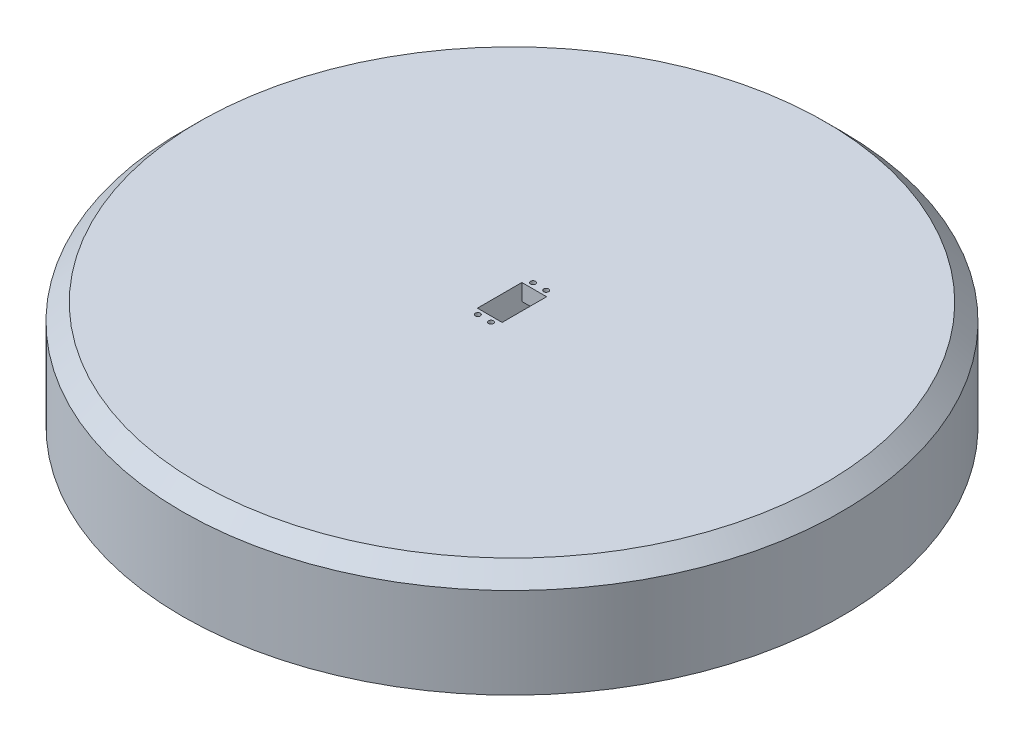
ISO-10303-21;
HEADER;
FILE_DESCRIPTION(('STEP AP214'),'2;1');
FILE_NAME('part.step','',(''),(''),'','','');
FILE_SCHEMA(('AUTOMOTIVE_DESIGN { 1 0 10303 214 1 1 1 1 }'));
ENDSEC;
DATA;
#1=APPLICATION_CONTEXT('core data for automotive mechanical design processes');
#2=APPLICATION_PROTOCOL_DEFINITION('international standard','automotive_design',2000,#1);
#3=PRODUCT_CONTEXT('',#1,'mechanical');
#4=PRODUCT('Part','Part','',(#3));
#5=PRODUCT_RELATED_PRODUCT_CATEGORY('part','',(#4));
#6=PRODUCT_DEFINITION_FORMATION('','',#4);
#7=PRODUCT_DEFINITION_CONTEXT('part definition',#1,'design');
#8=PRODUCT_DEFINITION('design','',#6,#7);
#9=PRODUCT_DEFINITION_SHAPE('','',#8);
#10=(LENGTH_UNIT() NAMED_UNIT(*) SI_UNIT(.MILLI.,.METRE.));
#11=(NAMED_UNIT(*) PLANE_ANGLE_UNIT() SI_UNIT($,.RADIAN.));
#12=(NAMED_UNIT(*) SI_UNIT($,.STERADIAN.) SOLID_ANGLE_UNIT());
#13=UNCERTAINTY_MEASURE_WITH_UNIT(LENGTH_MEASURE(1.E-05),#10,'distance_accuracy_value','');
#14=(GEOMETRIC_REPRESENTATION_CONTEXT(3) GLOBAL_UNCERTAINTY_ASSIGNED_CONTEXT((#13)) GLOBAL_UNIT_ASSIGNED_CONTEXT((#10,
#11,#12)) REPRESENTATION_CONTEXT('',''));
#15=CARTESIAN_POINT('',(0.,0.,0.));
#16=DIRECTION('',(0.,0.,1.));
#17=DIRECTION('',(1.,0.,0.));
#18=AXIS2_PLACEMENT_3D('',#15,#16,#17);
#19=CARTESIAN_POINT('',(0.,65.,0.));
#20=DIRECTION('',(0.,1.,0.));
#21=DIRECTION('',(0.,0.,1.));
#22=AXIS2_PLACEMENT_3D('',#19,#20,#21);
#23=PLANE('',#22);
#24=CARTESIAN_POINT('',(-4.,65.,-16.75));
#25=DIRECTION('',(0.,1.,0.));
#26=DIRECTION('',(0.,0.,1.));
#27=AXIS2_PLACEMENT_3D('',#24,#25,#26);
#28=CIRCLE('',#27,1.5);
#29=CARTESIAN_POINT('',(-4.,65.,-15.25));
#30=VERTEX_POINT('',#29);
#31=EDGE_CURVE('E274',#30,#30,#28,.T.);
#32=ORIENTED_EDGE('',*,*,#31,.F.);
#33=EDGE_LOOP('',(#32));
#34=FACE_BOUND('',#33,.T.);
#35=CARTESIAN_POINT('',(4.,65.,-16.75));
#36=DIRECTION('',(0.,-1.,0.));
#37=DIRECTION('',(0.,0.,-1.));
#38=AXIS2_PLACEMENT_3D('',#35,#36,#37);
#39=CIRCLE('',#38,1.5);
#40=CARTESIAN_POINT('',(4.,65.,-18.25));
#41=VERTEX_POINT('',#40);
#42=EDGE_CURVE('E265',#41,#41,#39,.T.);
#43=ORIENTED_EDGE('',*,*,#42,.T.);
#44=EDGE_LOOP('',(#43));
#45=FACE_BOUND('',#44,.T.);
#46=CARTESIAN_POINT('',(0.,65.,0.));
#47=DIRECTION('',(0.,1.,0.));
#48=DIRECTION('',(0.,0.,1.));
#49=AXIS2_PLACEMENT_3D('',#46,#47,#48);
#50=CIRCLE('',#49,190.);
#51=CARTESIAN_POINT('',(0.,65.,190.));
#52=VERTEX_POINT('',#51);
#53=EDGE_CURVE('E50',#52,#52,#50,.T.);
#54=ORIENTED_EDGE('',*,*,#53,.T.);
#55=EDGE_LOOP('',(#54));
#56=FACE_BOUND('',#55,.T.);
#57=DIRECTION('',(0.,0.,-1.));
#58=VECTOR('',#57,1.);
#59=CARTESIAN_POINT('',(7.5,65.,-13.5));
#60=LINE('',#59,#58);
#61=CARTESIAN_POINT('',(7.5,65.,13.5));
#62=VERTEX_POINT('',#61);
#63=CARTESIAN_POINT('',(7.5,65.,-13.5));
#64=VERTEX_POINT('',#63);
#65=EDGE_CURVE('E152',#62,#64,#60,.T.);
#66=ORIENTED_EDGE('',*,*,#65,.F.);
#67=DIRECTION('',(1.,0.,0.));
#68=VECTOR('',#67,1.);
#69=CARTESIAN_POINT('',(-7.5,65.,13.5));
#70=LINE('',#69,#68);
#71=CARTESIAN_POINT('',(-7.5,65.,13.5));
#72=VERTEX_POINT('',#71);
#73=EDGE_CURVE('E156',#72,#62,#70,.T.);
#74=ORIENTED_EDGE('',*,*,#73,.F.);
#75=DIRECTION('',(0.,0.,1.));
#76=VECTOR('',#75,1.);
#77=CARTESIAN_POINT('',(-7.5,65.,-13.5));
#78=LINE('',#77,#76);
#79=CARTESIAN_POINT('',(-7.5,65.,-13.5));
#80=VERTEX_POINT('',#79);
#81=EDGE_CURVE('E161',#80,#72,#78,.T.);
#82=ORIENTED_EDGE('',*,*,#81,.F.);
#83=DIRECTION('',(-1.,0.,0.));
#84=VECTOR('',#83,1.);
#85=CARTESIAN_POINT('',(-7.5,65.,-13.5));
#86=LINE('',#85,#84);
#87=EDGE_CURVE('E159',#64,#80,#86,.T.);
#88=ORIENTED_EDGE('',*,*,#87,.F.);
#89=EDGE_LOOP('',(#66,#74,#82,#88));
#90=FACE_BOUND('',#89,.T.);
#91=CARTESIAN_POINT('',(-4.,65.,16.75));
#92=DIRECTION('',(0.,-1.,0.));
#93=DIRECTION('',(0.,0.,-1.));
#94=AXIS2_PLACEMENT_3D('',#91,#92,#93);
#95=CIRCLE('',#94,1.5);
#96=CARTESIAN_POINT('',(-4.,65.,15.25));
#97=VERTEX_POINT('',#96);
#98=EDGE_CURVE('E254',#97,#97,#95,.T.);
#99=ORIENTED_EDGE('',*,*,#98,.T.);
#100=EDGE_LOOP('',(#99));
#101=FACE_BOUND('',#100,.T.);
#102=CARTESIAN_POINT('',(4.,65.,16.75));
#103=DIRECTION('',(0.,1.,0.));
#104=DIRECTION('',(0.,0.,1.));
#105=AXIS2_PLACEMENT_3D('',#102,#103,#104);
#106=CIRCLE('',#105,1.5);
#107=CARTESIAN_POINT('',(4.,65.,18.25));
#108=VERTEX_POINT('',#107);
#109=EDGE_CURVE('E257',#108,#108,#106,.T.);
#110=ORIENTED_EDGE('',*,*,#109,.F.);
#111=EDGE_LOOP('',(#110));
#112=FACE_BOUND('',#111,.T.);
#113=ADVANCED_FACE('F41',(#34,#45,#56,#90,#101,#112),#23,.T.);
#114=CARTESIAN_POINT('',(0.,55.,0.));
#115=DIRECTION('',(0.,1.,0.));
#116=DIRECTION('',(0.,0.,1.));
#117=AXIS2_PLACEMENT_3D('',#114,#115,#116);
#118=PLANE('',#117);
#119=CARTESIAN_POINT('',(4.,55.,-16.75));
#120=DIRECTION('',(0.,-1.,0.));
#121=DIRECTION('',(0.,0.,-1.));
#122=AXIS2_PLACEMENT_3D('',#119,#120,#121);
#123=CIRCLE('',#122,1.5);
#124=CARTESIAN_POINT('',(4.,55.,-18.25));
#125=VERTEX_POINT('',#124);
#126=EDGE_CURVE('E268',#125,#125,#123,.T.);
#127=ORIENTED_EDGE('',*,*,#126,.F.);
#128=EDGE_LOOP('',(#127));
#129=FACE_BOUND('',#128,.T.);
#130=DIRECTION('',(0.,0.,-1.));
#131=VECTOR('',#130,1.);
#132=CARTESIAN_POINT('',(-7.5,55.,20.));
#133=LINE('',#132,#131);
#134=CARTESIAN_POINT('',(-7.5,55.,-13.5));
#135=VERTEX_POINT('',#134);
#136=CARTESIAN_POINT('',(-7.5,55.,-20.));
#137=VERTEX_POINT('',#136);
#138=EDGE_CURVE('E120',#135,#137,#133,.T.);
#139=ORIENTED_EDGE('',*,*,#138,.T.);
#140=DIRECTION('',(1.,0.,0.));
#141=VECTOR('',#140,1.);
#142=CARTESIAN_POINT('',(-7.5,55.,-20.));
#143=LINE('',#142,#141);
#144=CARTESIAN_POINT('',(7.5,55.,-20.));
#145=VERTEX_POINT('',#144);
#146=EDGE_CURVE('E141',#137,#145,#143,.T.);
#147=ORIENTED_EDGE('',*,*,#146,.T.);
#148=DIRECTION('',(0.,0.,1.));
#149=VECTOR('',#148,1.);
#150=CARTESIAN_POINT('',(7.5,55.,20.));
#151=LINE('',#150,#149);
#152=CARTESIAN_POINT('',(7.5,55.,-13.5));
#153=VERTEX_POINT('',#152);
#154=EDGE_CURVE('E138',#145,#153,#151,.T.);
#155=ORIENTED_EDGE('',*,*,#154,.T.);
#156=DIRECTION('',(1.,0.,0.));
#157=VECTOR('',#156,1.);
#158=CARTESIAN_POINT('',(-7.5,55.,-13.5));
#159=LINE('',#158,#157);
#160=EDGE_CURVE('E174',#135,#153,#159,.T.);
#161=ORIENTED_EDGE('',*,*,#160,.F.);
#162=EDGE_LOOP('',(#139,#147,#155,#161));
#163=FACE_BOUND('',#162,.T.);
#164=CARTESIAN_POINT('',(-4.,55.,-16.75));
#165=DIRECTION('',(0.,1.,0.));
#166=DIRECTION('',(0.,0.,1.));
#167=AXIS2_PLACEMENT_3D('',#164,#165,#166);
#168=CIRCLE('',#167,1.5);
#169=CARTESIAN_POINT('',(-4.,55.,-15.25));
#170=VERTEX_POINT('',#169);
#171=EDGE_CURVE('E270',#170,#170,#168,.T.);
#172=ORIENTED_EDGE('',*,*,#171,.T.);
#173=EDGE_LOOP('',(#172));
#174=FACE_BOUND('',#173,.T.);
#175=ADVANCED_FACE('F194',(#129,#163,#174),#118,.F.);
#176=CARTESIAN_POINT('',(-4.,55.,16.75));
#177=DIRECTION('',(0.,-1.,0.));
#178=DIRECTION('',(0.,0.,-1.));
#179=AXIS2_PLACEMENT_3D('',#176,#177,#178);
#180=CIRCLE('',#179,1.5);
#181=CARTESIAN_POINT('',(-4.,55.,15.25));
#182=VERTEX_POINT('',#181);
#183=EDGE_CURVE('E278',#182,#182,#180,.T.);
#184=ORIENTED_EDGE('',*,*,#183,.F.);
#185=EDGE_LOOP('',(#184));
#186=FACE_BOUND('',#185,.T.);
#187=CARTESIAN_POINT('',(7.5,55.,13.5));
#188=VERTEX_POINT('',#187);
#189=CARTESIAN_POINT('',(7.5,55.,20.));
#190=VERTEX_POINT('',#189);
#191=EDGE_CURVE('E57',#188,#190,#151,.T.);
#192=ORIENTED_EDGE('',*,*,#191,.T.);
#193=DIRECTION('',(-1.,0.,0.));
#194=VECTOR('',#193,1.);
#195=CARTESIAN_POINT('',(-7.5,55.,20.));
#196=LINE('',#195,#194);
#197=CARTESIAN_POINT('',(-7.5,55.,20.));
#198=VERTEX_POINT('',#197);
#199=EDGE_CURVE('E126',#190,#198,#196,.T.);
#200=ORIENTED_EDGE('',*,*,#199,.T.);
#201=CARTESIAN_POINT('',(-7.5,55.,13.5));
#202=VERTEX_POINT('',#201);
#203=EDGE_CURVE('E109',#198,#202,#133,.T.);
#204=ORIENTED_EDGE('',*,*,#203,.T.);
#205=DIRECTION('',(-1.,0.,0.));
#206=VECTOR('',#205,1.);
#207=CARTESIAN_POINT('',(-7.5,55.,13.5));
#208=LINE('',#207,#206);
#209=EDGE_CURVE('E150',#188,#202,#208,.T.);
#210=ORIENTED_EDGE('',*,*,#209,.F.);
#211=EDGE_LOOP('',(#192,#200,#204,#210));
#212=FACE_BOUND('',#211,.T.);
#213=CARTESIAN_POINT('',(4.,55.,16.75));
#214=DIRECTION('',(0.,1.,0.));
#215=DIRECTION('',(0.,0.,1.));
#216=AXIS2_PLACEMENT_3D('',#213,#214,#215);
#217=CIRCLE('',#216,1.5);
#218=CARTESIAN_POINT('',(4.,55.,18.25));
#219=VERTEX_POINT('',#218);
#220=EDGE_CURVE('E259',#219,#219,#217,.T.);
#221=ORIENTED_EDGE('',*,*,#220,.T.);
#222=EDGE_LOOP('',(#221));
#223=FACE_BOUND('',#222,.T.);
#224=ADVANCED_FACE('F130',(#186,#212,#223),#118,.F.);
#225=CARTESIAN_POINT('',(0.,65.,0.));
#226=DIRECTION('',(0.,-1.,0.));
#227=DIRECTION('',(0.,0.,-1.));
#228=AXIS2_PLACEMENT_3D('',#225,#226,#227);
#229=CYLINDRICAL_SURFACE('',#228,200.);
#230=CARTESIAN_POINT('',(0.,54.9999999999999,0.));
#231=DIRECTION('',(0.,1.,0.));
#232=DIRECTION('',(0.,0.,1.));
#233=AXIS2_PLACEMENT_3D('',#230,#231,#232);
#234=CIRCLE('',#233,200.);
#235=CARTESIAN_POINT('',(0.,54.9999999999999,200.));
#236=VERTEX_POINT('',#235);
#237=EDGE_CURVE('E12',#236,#236,#234,.F.);
#238=ORIENTED_EDGE('',*,*,#237,.T.);
#239=EDGE_LOOP('',(#238));
#240=FACE_BOUND('',#239,.T.);
#241=CARTESIAN_POINT('',(0.,0.,0.));
#242=DIRECTION('',(0.,1.,0.));
#243=DIRECTION('',(0.,0.,1.));
#244=AXIS2_PLACEMENT_3D('',#241,#242,#243);
#245=CIRCLE('',#244,200.);
#246=CARTESIAN_POINT('',(0.,0.,200.));
#247=VERTEX_POINT('',#246);
#248=EDGE_CURVE('E167',#247,#247,#245,.T.);
#249=ORIENTED_EDGE('',*,*,#248,.T.);
#250=EDGE_LOOP('',(#249));
#251=FACE_BOUND('',#250,.T.);
#252=ADVANCED_FACE('F210',(#240,#251),#229,.T.);
#253=CARTESIAN_POINT('',(0.,0.,0.));
#254=DIRECTION('',(0.,1.,0.));
#255=DIRECTION('',(0.,0.,1.));
#256=AXIS2_PLACEMENT_3D('',#253,#254,#255);
#257=PLANE('',#256);
#258=DIRECTION('',(0.,0.,1.));
#259=VECTOR('',#258,1.);
#260=CARTESIAN_POINT('',(-7.5,0.,-13.5));
#261=LINE('',#260,#259);
#262=CARTESIAN_POINT('',(-7.5,0.,-20.));
#263=VERTEX_POINT('',#262);
#264=CARTESIAN_POINT('',(-7.5,0.,20.));
#265=VERTEX_POINT('',#264);
#266=EDGE_CURVE('E155',#263,#265,#261,.T.);
#267=ORIENTED_EDGE('',*,*,#266,.T.);
#268=DIRECTION('',(-1.,0.,0.));
#269=VECTOR('',#268,1.);
#270=CARTESIAN_POINT('',(-7.5,0.,20.));
#271=LINE('',#270,#269);
#272=CARTESIAN_POINT('',(7.5,0.,20.));
#273=VERTEX_POINT('',#272);
#274=EDGE_CURVE('E128',#273,#265,#271,.T.);
#275=ORIENTED_EDGE('',*,*,#274,.F.);
#276=DIRECTION('',(0.,0.,-1.));
#277=VECTOR('',#276,1.);
#278=CARTESIAN_POINT('',(7.5,0.,-13.5));
#279=LINE('',#278,#277);
#280=CARTESIAN_POINT('',(7.5,0.,-20.));
#281=VERTEX_POINT('',#280);
#282=EDGE_CURVE('E153',#273,#281,#279,.T.);
#283=ORIENTED_EDGE('',*,*,#282,.T.);
#284=DIRECTION('',(1.,0.,0.));
#285=VECTOR('',#284,1.);
#286=CARTESIAN_POINT('',(-7.5,0.,-20.));
#287=LINE('',#286,#285);
#288=EDGE_CURVE('E132',#263,#281,#287,.T.);
#289=ORIENTED_EDGE('',*,*,#288,.F.);
#290=EDGE_LOOP('',(#267,#275,#283,#289));
#291=FACE_BOUND('',#290,.T.);
#292=ORIENTED_EDGE('',*,*,#248,.F.);
#293=EDGE_LOOP('',(#292));
#294=FACE_BOUND('',#293,.T.);
#295=ADVANCED_FACE('F208',(#291,#294),#257,.F.);
#296=CARTESIAN_POINT('',(7.5,0.,-13.5));
#297=DIRECTION('',(1.,0.,0.));
#298=DIRECTION('',(0.,0.,-1.));
#299=AXIS2_PLACEMENT_3D('',#296,#297,#298);
#300=PLANE('',#299);
#301=DIRECTION('',(0.,1.,0.));
#302=VECTOR('',#301,1.);
#303=CARTESIAN_POINT('',(7.5,0.,-13.5));
#304=LINE('',#303,#302);
#305=EDGE_CURVE('E65',#153,#64,#304,.T.);
#306=ORIENTED_EDGE('',*,*,#305,.F.);
#307=ORIENTED_EDGE('',*,*,#154,.F.);
#308=DIRECTION('',(0.,-1.,0.));
#309=VECTOR('',#308,1.);
#310=CARTESIAN_POINT('',(7.5,107.720018726588,-20.));
#311=LINE('',#310,#309);
#312=EDGE_CURVE('E143',#145,#281,#311,.T.);
#313=ORIENTED_EDGE('',*,*,#312,.T.);
#314=ORIENTED_EDGE('',*,*,#282,.F.);
#315=DIRECTION('',(0.,-1.,0.));
#316=VECTOR('',#315,1.);
#317=CARTESIAN_POINT('',(7.5,107.720018726588,20.));
#318=LINE('',#317,#316);
#319=EDGE_CURVE('E140',#190,#273,#318,.T.);
#320=ORIENTED_EDGE('',*,*,#319,.F.);
#321=ORIENTED_EDGE('',*,*,#191,.F.);
#322=DIRECTION('',(0.,1.,0.));
#323=VECTOR('',#322,1.);
#324=CARTESIAN_POINT('',(7.5,0.,13.5));
#325=LINE('',#324,#323);
#326=EDGE_CURVE('E165',#188,#62,#325,.T.);
#327=ORIENTED_EDGE('',*,*,#326,.T.);
#328=ORIENTED_EDGE('',*,*,#65,.T.);
#329=EDGE_LOOP('',(#306,#307,#313,#314,#320,#321,#327,#328));
#330=FACE_BOUND('',#329,.T.);
#331=ADVANCED_FACE('F206',(#330),#300,.F.);
#332=CARTESIAN_POINT('',(-7.5,0.,13.5));
#333=DIRECTION('',(0.,0.,1.));
#334=DIRECTION('',(1.,0.,0.));
#335=AXIS2_PLACEMENT_3D('',#332,#333,#334);
#336=PLANE('',#335);
#337=ORIENTED_EDGE('',*,*,#326,.F.);
#338=ORIENTED_EDGE('',*,*,#209,.T.);
#339=DIRECTION('',(0.,1.,0.));
#340=VECTOR('',#339,1.);
#341=CARTESIAN_POINT('',(-7.5,0.,13.5));
#342=LINE('',#341,#340);
#343=EDGE_CURVE('E115',#202,#72,#342,.T.);
#344=ORIENTED_EDGE('',*,*,#343,.T.);
#345=ORIENTED_EDGE('',*,*,#73,.T.);
#346=EDGE_LOOP('',(#337,#338,#344,#345));
#347=FACE_BOUND('',#346,.T.);
#348=ADVANCED_FACE('F226',(#347),#336,.F.);
#349=CARTESIAN_POINT('',(-7.5,0.,-13.5));
#350=DIRECTION('',(-1.,0.,0.));
#351=DIRECTION('',(0.,0.,1.));
#352=AXIS2_PLACEMENT_3D('',#349,#350,#351);
#353=PLANE('',#352);
#354=ORIENTED_EDGE('',*,*,#343,.F.);
#355=ORIENTED_EDGE('',*,*,#203,.F.);
#356=DIRECTION('',(0.,-1.,0.));
#357=VECTOR('',#356,1.);
#358=CARTESIAN_POINT('',(-7.5,107.720018726588,20.));
#359=LINE('',#358,#357);
#360=EDGE_CURVE('E112',#198,#265,#359,.T.);
#361=ORIENTED_EDGE('',*,*,#360,.T.);
#362=ORIENTED_EDGE('',*,*,#266,.F.);
#363=DIRECTION('',(0.,-1.,0.));
#364=VECTOR('',#363,1.);
#365=CARTESIAN_POINT('',(-7.5,107.720018726588,-20.));
#366=LINE('',#365,#364);
#367=EDGE_CURVE('E119',#137,#263,#366,.T.);
#368=ORIENTED_EDGE('',*,*,#367,.F.);
#369=ORIENTED_EDGE('',*,*,#138,.F.);
#370=DIRECTION('',(0.,1.,0.));
#371=VECTOR('',#370,1.);
#372=CARTESIAN_POINT('',(-7.5,0.,-13.5));
#373=LINE('',#372,#371);
#374=EDGE_CURVE('E169',#135,#80,#373,.T.);
#375=ORIENTED_EDGE('',*,*,#374,.T.);
#376=ORIENTED_EDGE('',*,*,#81,.T.);
#377=EDGE_LOOP('',(#354,#355,#361,#362,#368,#369,#375,#376));
#378=FACE_BOUND('',#377,.T.);
#379=ADVANCED_FACE('F111',(#378),#353,.F.);
#380=CARTESIAN_POINT('',(-7.5,0.,-13.5));
#381=DIRECTION('',(0.,0.,-1.));
#382=DIRECTION('',(-1.,0.,0.));
#383=AXIS2_PLACEMENT_3D('',#380,#381,#382);
#384=PLANE('',#383);
#385=ORIENTED_EDGE('',*,*,#374,.F.);
#386=ORIENTED_EDGE('',*,*,#160,.T.);
#387=ORIENTED_EDGE('',*,*,#305,.T.);
#388=ORIENTED_EDGE('',*,*,#87,.T.);
#389=EDGE_LOOP('',(#385,#386,#387,#388));
#390=FACE_BOUND('',#389,.T.);
#391=ADVANCED_FACE('F231',(#390),#384,.F.);
#392=CARTESIAN_POINT('',(-7.5,107.720018726588,-20.));
#393=DIRECTION('',(0.,0.,-1.));
#394=DIRECTION('',(-1.,0.,0.));
#395=AXIS2_PLACEMENT_3D('',#392,#393,#394);
#396=PLANE('',#395);
#397=ORIENTED_EDGE('',*,*,#367,.T.);
#398=ORIENTED_EDGE('',*,*,#288,.T.);
#399=ORIENTED_EDGE('',*,*,#312,.F.);
#400=ORIENTED_EDGE('',*,*,#146,.F.);
#401=EDGE_LOOP('',(#397,#398,#399,#400));
#402=FACE_BOUND('',#401,.T.);
#403=ADVANCED_FACE('F190',(#402),#396,.F.);
#404=CARTESIAN_POINT('',(-7.5,107.720018726588,20.));
#405=DIRECTION('',(0.,0.,1.));
#406=DIRECTION('',(1.,0.,0.));
#407=AXIS2_PLACEMENT_3D('',#404,#405,#406);
#408=PLANE('',#407);
#409=ORIENTED_EDGE('',*,*,#319,.T.);
#410=ORIENTED_EDGE('',*,*,#274,.T.);
#411=ORIENTED_EDGE('',*,*,#360,.F.);
#412=ORIENTED_EDGE('',*,*,#199,.F.);
#413=EDGE_LOOP('',(#409,#410,#411,#412));
#414=FACE_BOUND('',#413,.T.);
#415=ADVANCED_FACE('F125',(#414),#408,.F.);
#416=CARTESIAN_POINT('',(0.,65.,0.));
#417=DIRECTION('',(0.,-1.,0.));
#418=DIRECTION('',(0.,0.,-1.));
#419=AXIS2_PLACEMENT_3D('',#416,#417,#418);
#420=CONICAL_SURFACE('',#419,190.,0.785398163397448);
#421=ORIENTED_EDGE('',*,*,#237,.F.);
#422=EDGE_LOOP('',(#421));
#423=FACE_BOUND('',#422,.T.);
#424=ORIENTED_EDGE('',*,*,#53,.F.);
#425=EDGE_LOOP('',(#424));
#426=FACE_BOUND('',#425,.T.);
#427=ADVANCED_FACE('F44',(#423,#426),#420,.T.);
#428=CARTESIAN_POINT('',(-4.,65.,16.75));
#429=DIRECTION('',(0.,-1.,0.));
#430=DIRECTION('',(0.,0.,-1.));
#431=AXIS2_PLACEMENT_3D('',#428,#429,#430);
#432=CYLINDRICAL_SURFACE('',#431,1.5);
#433=ORIENTED_EDGE('',*,*,#98,.F.);
#434=EDGE_LOOP('',(#433));
#435=FACE_BOUND('',#434,.T.);
#436=ORIENTED_EDGE('',*,*,#183,.T.);
#437=EDGE_LOOP('',(#436));
#438=FACE_BOUND('',#437,.T.);
#439=ADVANCED_FACE('F181',(#435,#438),#432,.F.);
#440=CARTESIAN_POINT('',(4.,65.,16.75));
#441=DIRECTION('',(0.,-1.,0.));
#442=DIRECTION('',(0.,0.,-1.));
#443=AXIS2_PLACEMENT_3D('',#440,#441,#442);
#444=CYLINDRICAL_SURFACE('',#443,1.5);
#445=ORIENTED_EDGE('',*,*,#109,.T.);
#446=EDGE_LOOP('',(#445));
#447=FACE_BOUND('',#446,.T.);
#448=ORIENTED_EDGE('',*,*,#220,.F.);
#449=EDGE_LOOP('',(#448));
#450=FACE_BOUND('',#449,.T.);
#451=ADVANCED_FACE('F187',(#447,#450),#444,.F.);
#452=CARTESIAN_POINT('',(4.,65.,-16.75));
#453=DIRECTION('',(0.,-1.,0.));
#454=DIRECTION('',(0.,0.,-1.));
#455=AXIS2_PLACEMENT_3D('',#452,#453,#454);
#456=CYLINDRICAL_SURFACE('',#455,1.5);
#457=ORIENTED_EDGE('',*,*,#42,.F.);
#458=EDGE_LOOP('',(#457));
#459=FACE_BOUND('',#458,.T.);
#460=ORIENTED_EDGE('',*,*,#126,.T.);
#461=EDGE_LOOP('',(#460));
#462=FACE_BOUND('',#461,.T.);
#463=ADVANCED_FACE('F287',(#459,#462),#456,.F.);
#464=CARTESIAN_POINT('',(-4.,65.,-16.75));
#465=DIRECTION('',(0.,-1.,0.));
#466=DIRECTION('',(0.,0.,-1.));
#467=AXIS2_PLACEMENT_3D('',#464,#465,#466);
#468=CYLINDRICAL_SURFACE('',#467,1.5);
#469=ORIENTED_EDGE('',*,*,#31,.T.);
#470=EDGE_LOOP('',(#469));
#471=FACE_BOUND('',#470,.T.);
#472=ORIENTED_EDGE('',*,*,#171,.F.);
#473=EDGE_LOOP('',(#472));
#474=FACE_BOUND('',#473,.T.);
#475=ADVANCED_FACE('F284',(#471,#474),#468,.F.);
#476=CLOSED_SHELL('',(#113,#175,#224,#252,#295,#331,#348,#379,#391,#403,#415,#427,#439,#451,
#463,#475));
#477=MANIFOLD_SOLID_BREP('B2',#476);
#478=ADVANCED_BREP_SHAPE_REPRESENTATION('',(#18,#477),#14);
#479=SHAPE_DEFINITION_REPRESENTATION(#9,#478);
ENDSEC;
END-ISO-10303-21;
